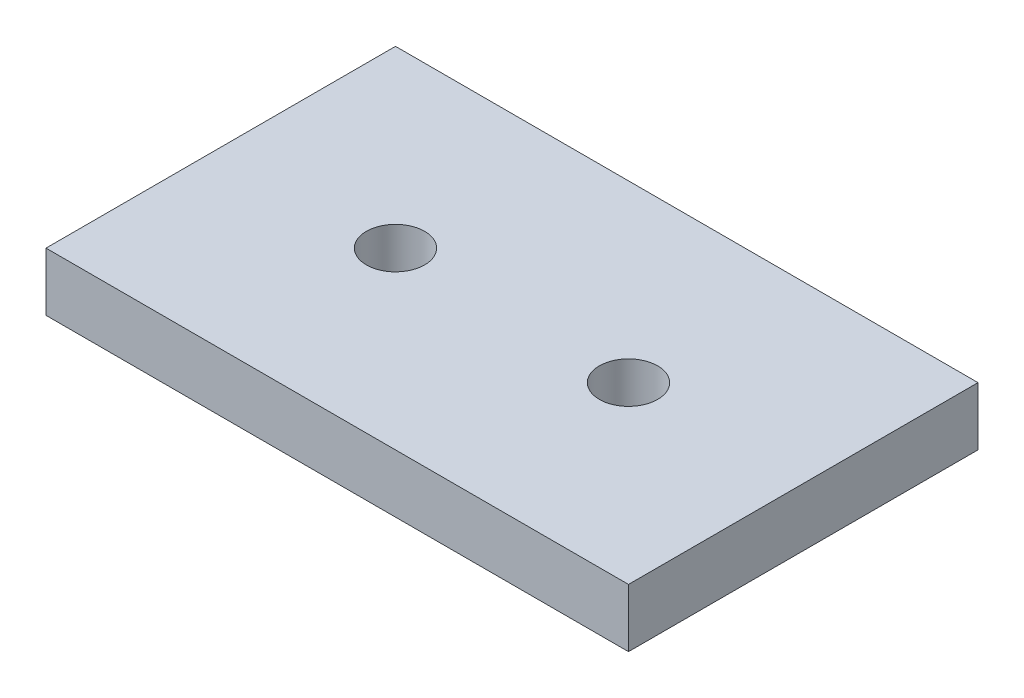
ISO-10303-21;
HEADER;
FILE_DESCRIPTION(('STEP AP214'),'2;1');
FILE_NAME('part.step','',(''),(''),'','','');
FILE_SCHEMA(('AUTOMOTIVE_DESIGN { 1 0 10303 214 1 1 1 1 }'));
ENDSEC;
DATA;
#1=APPLICATION_CONTEXT('core data for automotive mechanical design processes');
#2=APPLICATION_PROTOCOL_DEFINITION('international standard','automotive_design',2000,#1);
#3=PRODUCT_CONTEXT('',#1,'mechanical');
#4=PRODUCT('Part','Part','',(#3));
#5=PRODUCT_RELATED_PRODUCT_CATEGORY('part','',(#4));
#6=PRODUCT_DEFINITION_FORMATION('','',#4);
#7=PRODUCT_DEFINITION_CONTEXT('part definition',#1,'design');
#8=PRODUCT_DEFINITION('design','',#6,#7);
#9=PRODUCT_DEFINITION_SHAPE('','',#8);
#10=(LENGTH_UNIT() NAMED_UNIT(*) SI_UNIT(.MILLI.,.METRE.));
#11=(NAMED_UNIT(*) PLANE_ANGLE_UNIT() SI_UNIT($,.RADIAN.));
#12=(NAMED_UNIT(*) SI_UNIT($,.STERADIAN.) SOLID_ANGLE_UNIT());
#13=UNCERTAINTY_MEASURE_WITH_UNIT(LENGTH_MEASURE(1.E-05),#10,'distance_accuracy_value','');
#14=(GEOMETRIC_REPRESENTATION_CONTEXT(3) GLOBAL_UNCERTAINTY_ASSIGNED_CONTEXT((#13)) GLOBAL_UNIT_ASSIGNED_CONTEXT((#10,
#11,#12)) REPRESENTATION_CONTEXT('',''));
#15=CARTESIAN_POINT('',(0.,0.,0.));
#16=DIRECTION('',(0.,0.,1.));
#17=DIRECTION('',(1.,0.,0.));
#18=AXIS2_PLACEMENT_3D('',#15,#16,#17);
#19=CARTESIAN_POINT('',(50.,10.,30.));
#20=DIRECTION('',(-1.,0.,0.));
#21=DIRECTION('',(0.,0.,1.));
#22=AXIS2_PLACEMENT_3D('',#19,#20,#21);
#23=PLANE('',#22);
#24=DIRECTION('',(0.,0.,-1.));
#25=VECTOR('',#24,1.);
#26=CARTESIAN_POINT('',(50.,0.,30.));
#27=LINE('',#26,#25);
#28=CARTESIAN_POINT('',(50.,0.,30.));
#29=VERTEX_POINT('',#28);
#30=CARTESIAN_POINT('',(50.,0.,-30.));
#31=VERTEX_POINT('',#30);
#32=EDGE_CURVE('E110',#29,#31,#27,.T.);
#33=ORIENTED_EDGE('',*,*,#32,.T.);
#34=DIRECTION('',(0.,-1.,0.));
#35=VECTOR('',#34,1.);
#36=CARTESIAN_POINT('',(50.,10.,-30.));
#37=LINE('',#36,#35);
#38=CARTESIAN_POINT('',(50.,10.,-30.));
#39=VERTEX_POINT('',#38);
#40=EDGE_CURVE('E101',#39,#31,#37,.T.);
#41=ORIENTED_EDGE('',*,*,#40,.F.);
#42=DIRECTION('',(0.,0.,-1.));
#43=VECTOR('',#42,1.);
#44=CARTESIAN_POINT('',(50.,10.,30.));
#45=LINE('',#44,#43);
#46=CARTESIAN_POINT('',(50.,10.,30.));
#47=VERTEX_POINT('',#46);
#48=EDGE_CURVE('E95',#47,#39,#45,.T.);
#49=ORIENTED_EDGE('',*,*,#48,.F.);
#50=DIRECTION('',(0.,-1.,0.));
#51=VECTOR('',#50,1.);
#52=CARTESIAN_POINT('',(50.,10.,30.));
#53=LINE('',#52,#51);
#54=EDGE_CURVE('E106',#47,#29,#53,.T.);
#55=ORIENTED_EDGE('',*,*,#54,.T.);
#56=EDGE_LOOP('',(#33,#41,#49,#55));
#57=FACE_BOUND('',#56,.T.);
#58=ADVANCED_FACE('F41',(#57),#23,.F.);
#59=CARTESIAN_POINT('',(-50.,10.,-30.));
#60=DIRECTION('',(0.,0.,1.));
#61=DIRECTION('',(1.,0.,0.));
#62=AXIS2_PLACEMENT_3D('',#59,#60,#61);
#63=PLANE('',#62);
#64=DIRECTION('',(-1.,0.,0.));
#65=VECTOR('',#64,1.);
#66=CARTESIAN_POINT('',(-50.,0.,-30.));
#67=LINE('',#66,#65);
#68=CARTESIAN_POINT('',(-50.,0.,-30.));
#69=VERTEX_POINT('',#68);
#70=EDGE_CURVE('E100',#31,#69,#67,.T.);
#71=ORIENTED_EDGE('',*,*,#70,.T.);
#72=DIRECTION('',(0.,-1.,0.));
#73=VECTOR('',#72,1.);
#74=CARTESIAN_POINT('',(-50.,10.,-30.));
#75=LINE('',#74,#73);
#76=CARTESIAN_POINT('',(-50.,10.,-30.));
#77=VERTEX_POINT('',#76);
#78=EDGE_CURVE('E98',#77,#69,#75,.T.);
#79=ORIENTED_EDGE('',*,*,#78,.F.);
#80=DIRECTION('',(-1.,0.,0.));
#81=VECTOR('',#80,1.);
#82=CARTESIAN_POINT('',(-50.,10.,-30.));
#83=LINE('',#82,#81);
#84=EDGE_CURVE('E90',#39,#77,#83,.T.);
#85=ORIENTED_EDGE('',*,*,#84,.F.);
#86=ORIENTED_EDGE('',*,*,#40,.T.);
#87=EDGE_LOOP('',(#71,#79,#85,#86));
#88=FACE_BOUND('',#87,.T.);
#89=ADVANCED_FACE('F99',(#88),#63,.F.);
#90=CARTESIAN_POINT('',(-50.,10.,30.));
#91=DIRECTION('',(1.,0.,0.));
#92=DIRECTION('',(0.,0.,-1.));
#93=AXIS2_PLACEMENT_3D('',#90,#91,#92);
#94=PLANE('',#93);
#95=DIRECTION('',(0.,0.,1.));
#96=VECTOR('',#95,1.);
#97=CARTESIAN_POINT('',(-50.,0.,30.));
#98=LINE('',#97,#96);
#99=CARTESIAN_POINT('',(-50.,0.,30.));
#100=VERTEX_POINT('',#99);
#101=EDGE_CURVE('E76',#69,#100,#98,.T.);
#102=ORIENTED_EDGE('',*,*,#101,.T.);
#103=DIRECTION('',(0.,-1.,0.));
#104=VECTOR('',#103,1.);
#105=CARTESIAN_POINT('',(-50.,10.,30.));
#106=LINE('',#105,#104);
#107=CARTESIAN_POINT('',(-50.,10.,30.));
#108=VERTEX_POINT('',#107);
#109=EDGE_CURVE('E102',#108,#100,#106,.T.);
#110=ORIENTED_EDGE('',*,*,#109,.F.);
#111=DIRECTION('',(0.,0.,1.));
#112=VECTOR('',#111,1.);
#113=CARTESIAN_POINT('',(-50.,10.,30.));
#114=LINE('',#113,#112);
#115=EDGE_CURVE('E93',#77,#108,#114,.T.);
#116=ORIENTED_EDGE('',*,*,#115,.F.);
#117=ORIENTED_EDGE('',*,*,#78,.T.);
#118=EDGE_LOOP('',(#102,#110,#116,#117));
#119=FACE_BOUND('',#118,.T.);
#120=ADVANCED_FACE('F104',(#119),#94,.F.);
#121=CARTESIAN_POINT('',(-50.,10.,30.));
#122=DIRECTION('',(0.,0.,-1.));
#123=DIRECTION('',(-1.,0.,0.));
#124=AXIS2_PLACEMENT_3D('',#121,#122,#123);
#125=PLANE('',#124);
#126=DIRECTION('',(1.,0.,0.));
#127=VECTOR('',#126,1.);
#128=CARTESIAN_POINT('',(-50.,0.,30.));
#129=LINE('',#128,#127);
#130=EDGE_CURVE('E82',#100,#29,#129,.T.);
#131=ORIENTED_EDGE('',*,*,#130,.T.);
#132=ORIENTED_EDGE('',*,*,#54,.F.);
#133=DIRECTION('',(1.,0.,0.));
#134=VECTOR('',#133,1.);
#135=CARTESIAN_POINT('',(-50.,10.,30.));
#136=LINE('',#135,#134);
#137=EDGE_CURVE('E59',#108,#47,#136,.T.);
#138=ORIENTED_EDGE('',*,*,#137,.F.);
#139=ORIENTED_EDGE('',*,*,#109,.T.);
#140=EDGE_LOOP('',(#131,#132,#138,#139));
#141=FACE_BOUND('',#140,.T.);
#142=ADVANCED_FACE('F145',(#141),#125,.F.);
#143=CARTESIAN_POINT('',(0.,10.,0.));
#144=DIRECTION('',(0.,-1.,0.));
#145=DIRECTION('',(0.,0.,-1.));
#146=AXIS2_PLACEMENT_3D('',#143,#144,#145);
#147=PLANE('',#146);
#148=CARTESIAN_POINT('',(20.,10.,0.));
#149=DIRECTION('',(0.,-1.,0.));
#150=DIRECTION('',(0.,0.,-1.));
#151=AXIS2_PLACEMENT_3D('',#148,#149,#150);
#152=CIRCLE('',#151,5.);
#153=CARTESIAN_POINT('',(20.,10.,-5.));
#154=VERTEX_POINT('',#153);
#155=EDGE_CURVE('E255',#154,#154,#152,.F.);
#156=ORIENTED_EDGE('',*,*,#155,.F.);
#157=EDGE_LOOP('',(#156));
#158=FACE_BOUND('',#157,.T.);
#159=CARTESIAN_POINT('',(-20.,10.,0.));
#160=DIRECTION('',(0.,-1.,0.));
#161=DIRECTION('',(0.,0.,-1.));
#162=AXIS2_PLACEMENT_3D('',#159,#160,#161);
#163=CIRCLE('',#162,5.);
#164=CARTESIAN_POINT('',(-20.,10.,-5.));
#165=VERTEX_POINT('',#164);
#166=EDGE_CURVE('E113',#165,#165,#163,.F.);
#167=ORIENTED_EDGE('',*,*,#166,.F.);
#168=EDGE_LOOP('',(#167));
#169=FACE_BOUND('',#168,.T.);
#170=ORIENTED_EDGE('',*,*,#48,.T.);
#171=ORIENTED_EDGE('',*,*,#84,.T.);
#172=ORIENTED_EDGE('',*,*,#115,.T.);
#173=ORIENTED_EDGE('',*,*,#137,.T.);
#174=EDGE_LOOP('',(#170,#171,#172,#173));
#175=FACE_BOUND('',#174,.T.);
#176=ADVANCED_FACE('F91',(#158,#169,#175),#147,.F.);
#177=CARTESIAN_POINT('',(0.,0.,0.));
#178=DIRECTION('',(0.,-1.,0.));
#179=DIRECTION('',(0.,0.,-1.));
#180=AXIS2_PLACEMENT_3D('',#177,#178,#179);
#181=PLANE('',#180);
#182=CARTESIAN_POINT('',(20.,0.,0.));
#183=DIRECTION('',(0.,-1.,0.));
#184=DIRECTION('',(0.,0.,-1.));
#185=AXIS2_PLACEMENT_3D('',#182,#183,#184);
#186=CIRCLE('',#185,6.00000000000001);
#187=CARTESIAN_POINT('',(20.,0.,-6.00000000000001));
#188=VERTEX_POINT('',#187);
#189=EDGE_CURVE('E123',#188,#188,#186,.F.);
#190=ORIENTED_EDGE('',*,*,#189,.T.);
#191=EDGE_LOOP('',(#190));
#192=FACE_BOUND('',#191,.T.);
#193=CARTESIAN_POINT('',(-20.,0.,0.));
#194=DIRECTION('',(0.,-1.,0.));
#195=DIRECTION('',(0.,0.,-1.));
#196=AXIS2_PLACEMENT_3D('',#193,#194,#195);
#197=CIRCLE('',#196,6.00000000000001);
#198=CARTESIAN_POINT('',(-20.,0.,-6.00000000000001));
#199=VERTEX_POINT('',#198);
#200=EDGE_CURVE('E120',#199,#199,#197,.F.);
#201=ORIENTED_EDGE('',*,*,#200,.T.);
#202=EDGE_LOOP('',(#201));
#203=FACE_BOUND('',#202,.T.);
#204=ORIENTED_EDGE('',*,*,#32,.F.);
#205=ORIENTED_EDGE('',*,*,#130,.F.);
#206=ORIENTED_EDGE('',*,*,#101,.F.);
#207=ORIENTED_EDGE('',*,*,#70,.F.);
#208=EDGE_LOOP('',(#204,#205,#206,#207));
#209=FACE_BOUND('',#208,.T.);
#210=ADVANCED_FACE('F136',(#192,#203,#209),#181,.T.);
#211=CARTESIAN_POINT('',(-20.,20.,0.));
#212=DIRECTION('',(0.,-1.,0.));
#213=DIRECTION('',(0.,0.,-1.));
#214=AXIS2_PLACEMENT_3D('',#211,#212,#213);
#215=CYLINDRICAL_SURFACE('',#214,5.);
#216=CARTESIAN_POINT('',(-20.,1.00000000000001,0.));
#217=DIRECTION('',(0.,-1.,0.));
#218=DIRECTION('',(0.,0.,-1.));
#219=AXIS2_PLACEMENT_3D('',#216,#217,#218);
#220=CIRCLE('',#219,5.);
#221=CARTESIAN_POINT('',(-20.,1.00000000000001,-5.));
#222=VERTEX_POINT('',#221);
#223=EDGE_CURVE('E11',#222,#222,#220,.T.);
#224=ORIENTED_EDGE('',*,*,#223,.T.);
#225=EDGE_LOOP('',(#224));
#226=FACE_BOUND('',#225,.T.);
#227=ORIENTED_EDGE('',*,*,#166,.T.);
#228=EDGE_LOOP('',(#227));
#229=FACE_BOUND('',#228,.T.);
#230=ADVANCED_FACE('F139',(#226,#229),#215,.F.);
#231=CARTESIAN_POINT('',(20.,20.,0.));
#232=DIRECTION('',(0.,-1.,0.));
#233=DIRECTION('',(0.,0.,-1.));
#234=AXIS2_PLACEMENT_3D('',#231,#232,#233);
#235=CYLINDRICAL_SURFACE('',#234,5.);
#236=CARTESIAN_POINT('',(20.,1.00000000000001,0.));
#237=DIRECTION('',(0.,-1.,0.));
#238=DIRECTION('',(0.,0.,-1.));
#239=AXIS2_PLACEMENT_3D('',#236,#237,#238);
#240=CIRCLE('',#239,5.);
#241=CARTESIAN_POINT('',(20.,1.00000000000001,-5.));
#242=VERTEX_POINT('',#241);
#243=EDGE_CURVE('E51',#242,#242,#240,.T.);
#244=ORIENTED_EDGE('',*,*,#243,.T.);
#245=EDGE_LOOP('',(#244));
#246=FACE_BOUND('',#245,.T.);
#247=ORIENTED_EDGE('',*,*,#155,.T.);
#248=EDGE_LOOP('',(#247));
#249=FACE_BOUND('',#248,.T.);
#250=ADVANCED_FACE('F128',(#246,#249),#235,.F.);
#251=CARTESIAN_POINT('',(20.,0.,0.));
#252=DIRECTION('',(0.,-1.,0.));
#253=DIRECTION('',(0.,0.,-1.));
#254=AXIS2_PLACEMENT_3D('',#251,#252,#253);
#255=CONICAL_SURFACE('',#254,6.00000000000001,0.785398163397445);
#256=ORIENTED_EDGE('',*,*,#243,.F.);
#257=EDGE_LOOP('',(#256));
#258=FACE_BOUND('',#257,.T.);
#259=ORIENTED_EDGE('',*,*,#189,.F.);
#260=EDGE_LOOP('',(#259));
#261=FACE_BOUND('',#260,.T.);
#262=ADVANCED_FACE('F131',(#258,#261),#255,.F.);
#263=CARTESIAN_POINT('',(-20.,0.,0.));
#264=DIRECTION('',(0.,-1.,0.));
#265=DIRECTION('',(0.,0.,-1.));
#266=AXIS2_PLACEMENT_3D('',#263,#264,#265);
#267=CONICAL_SURFACE('',#266,6.00000000000001,0.785398163397445);
#268=ORIENTED_EDGE('',*,*,#223,.F.);
#269=EDGE_LOOP('',(#268));
#270=FACE_BOUND('',#269,.T.);
#271=ORIENTED_EDGE('',*,*,#200,.F.);
#272=EDGE_LOOP('',(#271));
#273=FACE_BOUND('',#272,.T.);
#274=ADVANCED_FACE('F44',(#270,#273),#267,.F.);
#275=CLOSED_SHELL('',(#58,#89,#120,#142,#176,#210,#230,#250,#262,#274));
#276=MANIFOLD_SOLID_BREP('B2',#275);
#277=ADVANCED_BREP_SHAPE_REPRESENTATION('',(#18,#276),#14);
#278=SHAPE_DEFINITION_REPRESENTATION(#9,#277);
ENDSEC;
END-ISO-10303-21;
